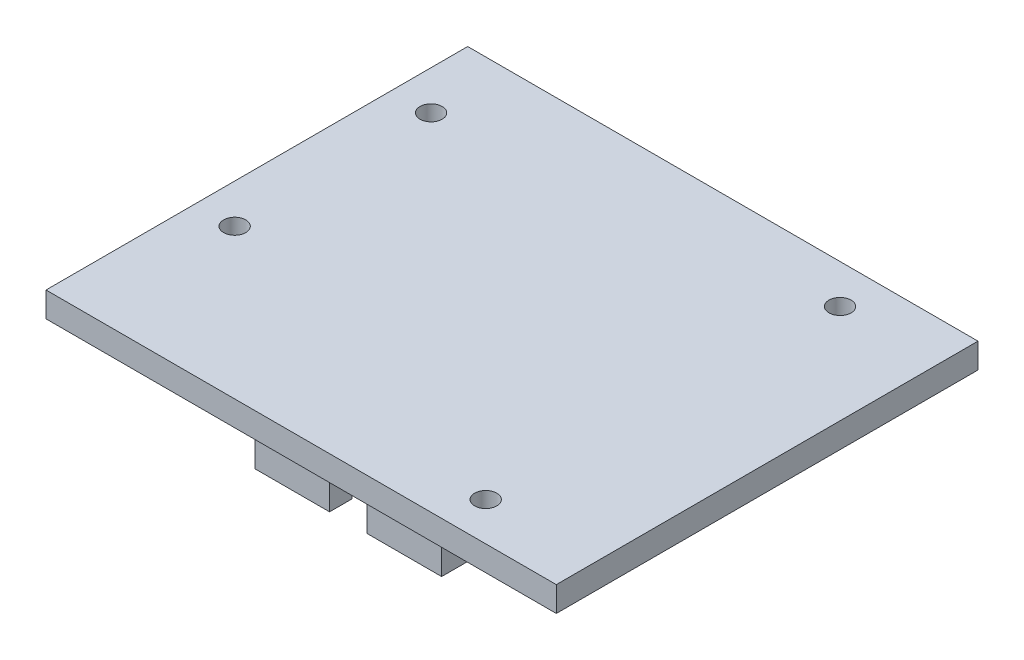
ISO-10303-21;
HEADER;
FILE_DESCRIPTION(('STEP AP214'),'2;1');
FILE_NAME('part.step','',(''),(''),'','','');
FILE_SCHEMA(('AUTOMOTIVE_DESIGN { 1 0 10303 214 1 1 1 1 }'));
ENDSEC;
DATA;
#1=APPLICATION_CONTEXT('core data for automotive mechanical design processes');
#2=APPLICATION_PROTOCOL_DEFINITION('international standard','automotive_design',2000,#1);
#3=PRODUCT_CONTEXT('',#1,'mechanical');
#4=PRODUCT('Part','Part','',(#3));
#5=PRODUCT_RELATED_PRODUCT_CATEGORY('part','',(#4));
#6=PRODUCT_DEFINITION_FORMATION('','',#4);
#7=PRODUCT_DEFINITION_CONTEXT('part definition',#1,'design');
#8=PRODUCT_DEFINITION('design','',#6,#7);
#9=PRODUCT_DEFINITION_SHAPE('','',#8);
#10=(LENGTH_UNIT() NAMED_UNIT(*) SI_UNIT(.MILLI.,.METRE.));
#11=(NAMED_UNIT(*) PLANE_ANGLE_UNIT() SI_UNIT($,.RADIAN.));
#12=(NAMED_UNIT(*) SI_UNIT($,.STERADIAN.) SOLID_ANGLE_UNIT());
#13=UNCERTAINTY_MEASURE_WITH_UNIT(LENGTH_MEASURE(1.E-05),#10,'distance_accuracy_value','');
#14=(GEOMETRIC_REPRESENTATION_CONTEXT(3) GLOBAL_UNCERTAINTY_ASSIGNED_CONTEXT((#13)) GLOBAL_UNIT_ASSIGNED_CONTEXT((#10,
#11,#12)) REPRESENTATION_CONTEXT('',''));
#15=CARTESIAN_POINT('',(0.,0.,0.));
#16=DIRECTION('',(0.,0.,1.));
#17=DIRECTION('',(1.,0.,0.));
#18=AXIS2_PLACEMENT_3D('',#15,#16,#17);
#19=CARTESIAN_POINT('',(2.525,-3.5,12.9));
#20=DIRECTION('',(1.,0.,0.));
#21=DIRECTION('',(0.,1.,0.));
#22=AXIS2_PLACEMENT_3D('',#19,#20,#21);
#23=PLANE('',#22);
#24=DIRECTION('',(0.,0.,-1.));
#25=VECTOR('',#24,1.);
#26=CARTESIAN_POINT('',(2.525,-3.65,22.9));
#27=LINE('',#26,#25);
#28=CARTESIAN_POINT('',(2.525,-3.65,22.9));
#29=VERTEX_POINT('',#28);
#30=CARTESIAN_POINT('',(2.525,-3.65,19.775));
#31=VERTEX_POINT('',#30);
#32=EDGE_CURVE('E171',#29,#31,#27,.T.);
#33=ORIENTED_EDGE('',*,*,#32,.F.);
#34=DIRECTION('',(0.,1.,0.));
#35=VECTOR('',#34,1.);
#36=CARTESIAN_POINT('',(2.525,-3.5,22.9));
#37=LINE('',#36,#35);
#38=CARTESIAN_POINT('',(2.525,-3.5,22.9));
#39=VERTEX_POINT('',#38);
#40=EDGE_CURVE('E378',#29,#39,#37,.T.);
#41=ORIENTED_EDGE('',*,*,#40,.T.);
#42=DIRECTION('',(0.,0.,1.));
#43=VECTOR('',#42,1.);
#44=CARTESIAN_POINT('',(2.525,-3.5,12.9));
#45=LINE('',#44,#43);
#46=CARTESIAN_POINT('',(2.525,-3.5,19.775));
#47=VERTEX_POINT('',#46);
#48=EDGE_CURVE('E191',#47,#39,#45,.T.);
#49=ORIENTED_EDGE('',*,*,#48,.F.);
#50=DIRECTION('',(0.,1.,0.));
#51=VECTOR('',#50,1.);
#52=CARTESIAN_POINT('',(2.525,-3.5,19.775));
#53=LINE('',#52,#51);
#54=EDGE_CURVE('E185',#31,#47,#53,.T.);
#55=ORIENTED_EDGE('',*,*,#54,.F.);
#56=EDGE_LOOP('',(#33,#41,#49,#55));
#57=FACE_BOUND('',#56,.T.);
#58=ADVANCED_FACE('F33',(#57),#23,.F.);
#59=CARTESIAN_POINT('',(13.055,-13.65,22.9));
#60=DIRECTION('',(0.,0.,-1.));
#61=DIRECTION('',(-1.,0.,0.));
#62=AXIS2_PLACEMENT_3D('',#59,#60,#61);
#63=PLANE('',#62);
#64=DIRECTION('',(-1.,0.,0.));
#65=VECTOR('',#64,1.);
#66=CARTESIAN_POINT('',(2.525,-3.65,22.9));
#67=LINE('',#66,#65);
#68=CARTESIAN_POINT('',(2.625,-3.65,22.9));
#69=VERTEX_POINT('',#68);
#70=EDGE_CURVE('E50',#69,#29,#67,.T.);
#71=ORIENTED_EDGE('',*,*,#70,.F.);
#72=DIRECTION('',(0.,-1.,0.));
#73=VECTOR('',#72,1.);
#74=CARTESIAN_POINT('',(2.625,-3.65,22.9));
#75=LINE('',#74,#73);
#76=CARTESIAN_POINT('',(2.625,-13.65,22.9));
#77=VERTEX_POINT('',#76);
#78=EDGE_CURVE('E415',#69,#77,#75,.T.);
#79=ORIENTED_EDGE('',*,*,#78,.T.);
#80=DIRECTION('',(-1.,0.,0.));
#81=VECTOR('',#80,1.);
#82=CARTESIAN_POINT('',(13.055,-13.65,22.9));
#83=LINE('',#82,#81);
#84=CARTESIAN_POINT('',(13.055,-13.65,22.9));
#85=VERTEX_POINT('',#84);
#86=EDGE_CURVE('E243',#85,#77,#83,.T.);
#87=ORIENTED_EDGE('',*,*,#86,.F.);
#88=DIRECTION('',(0.,1.,0.));
#89=VECTOR('',#88,1.);
#90=CARTESIAN_POINT('',(13.055,-13.65,22.9));
#91=LINE('',#90,#89);
#92=CARTESIAN_POINT('',(13.055,-3.5,22.9));
#93=VERTEX_POINT('',#92);
#94=EDGE_CURVE('E260',#85,#93,#91,.T.);
#95=ORIENTED_EDGE('',*,*,#94,.T.);
#96=DIRECTION('',(-1.,0.,0.));
#97=VECTOR('',#96,1.);
#98=CARTESIAN_POINT('',(13.055,-3.5,22.9));
#99=LINE('',#98,#97);
#100=EDGE_CURVE('E238',#93,#39,#99,.T.);
#101=ORIENTED_EDGE('',*,*,#100,.T.);
#102=ORIENTED_EDGE('',*,*,#40,.F.);
#103=EDGE_LOOP('',(#71,#79,#87,#95,#101,#102));
#104=FACE_BOUND('',#103,.T.);
#105=ADVANCED_FACE('F438',(#104),#63,.F.);
#106=CARTESIAN_POINT('',(10.,-3.5,19.775));
#107=DIRECTION('',(0.,0.,1.));
#108=DIRECTION('',(1.,0.,0.));
#109=AXIS2_PLACEMENT_3D('',#106,#107,#108);
#110=PLANE('',#109);
#111=DIRECTION('',(-1.,0.,0.));
#112=VECTOR('',#111,1.);
#113=CARTESIAN_POINT('',(10.,-13.65,19.775));
#114=LINE('',#113,#112);
#115=CARTESIAN_POINT('',(10.,-13.65,19.775));
#116=VERTEX_POINT('',#115);
#117=CARTESIAN_POINT('',(2.625,-13.65,19.775));
#118=VERTEX_POINT('',#117);
#119=EDGE_CURVE('E207',#116,#118,#114,.T.);
#120=ORIENTED_EDGE('',*,*,#119,.T.);
#121=DIRECTION('',(0.,-1.,0.));
#122=VECTOR('',#121,1.);
#123=CARTESIAN_POINT('',(2.625,-3.65,19.775));
#124=LINE('',#123,#122);
#125=CARTESIAN_POINT('',(2.625,-3.65,19.775));
#126=VERTEX_POINT('',#125);
#127=EDGE_CURVE('E187',#126,#118,#124,.T.);
#128=ORIENTED_EDGE('',*,*,#127,.F.);
#129=DIRECTION('',(1.,0.,0.));
#130=VECTOR('',#129,1.);
#131=CARTESIAN_POINT('',(2.525,-3.65,19.775));
#132=LINE('',#131,#130);
#133=EDGE_CURVE('E174',#31,#126,#132,.T.);
#134=ORIENTED_EDGE('',*,*,#133,.F.);
#135=ORIENTED_EDGE('',*,*,#54,.T.);
#136=DIRECTION('',(-1.,0.,0.));
#137=VECTOR('',#136,1.);
#138=CARTESIAN_POINT('',(10.,-3.5,19.775));
#139=LINE('',#138,#137);
#140=CARTESIAN_POINT('',(10.,-3.5,19.775));
#141=VERTEX_POINT('',#140);
#142=EDGE_CURVE('E214',#141,#47,#139,.T.);
#143=ORIENTED_EDGE('',*,*,#142,.F.);
#144=DIRECTION('',(0.,-1.,0.));
#145=VECTOR('',#144,1.);
#146=CARTESIAN_POINT('',(10.,-3.5,19.775));
#147=LINE('',#146,#145);
#148=EDGE_CURVE('E228',#141,#116,#147,.T.);
#149=ORIENTED_EDGE('',*,*,#148,.T.);
#150=EDGE_LOOP('',(#120,#128,#134,#135,#143,#149));
#151=FACE_BOUND('',#150,.T.);
#152=ADVANCED_FACE('F183',(#151),#110,.F.);
#153=CARTESIAN_POINT('',(0.,-3.5,0.));
#154=DIRECTION('',(0.,1.,0.));
#155=DIRECTION('',(0.,0.,1.));
#156=AXIS2_PLACEMENT_3D('',#153,#154,#155);
#157=PLANE('',#156);
#158=DIRECTION('',(0.,0.,1.));
#159=VECTOR('',#158,1.);
#160=CARTESIAN_POINT('',(-35.7,-3.5,29.5));
#161=LINE('',#160,#159);
#162=CARTESIAN_POINT('',(-35.7,-3.5,-29.5));
#163=VERTEX_POINT('',#162);
#164=CARTESIAN_POINT('',(-35.7,-3.5,29.5));
#165=VERTEX_POINT('',#164);
#166=EDGE_CURVE('E285',#163,#165,#161,.T.);
#167=ORIENTED_EDGE('',*,*,#166,.F.);
#168=DIRECTION('',(-1.,0.,0.));
#169=VECTOR('',#168,1.);
#170=CARTESIAN_POINT('',(35.7,-3.5,-29.5));
#171=LINE('',#170,#169);
#172=CARTESIAN_POINT('',(35.7,-3.5,-29.5));
#173=VERTEX_POINT('',#172);
#174=EDGE_CURVE('E295',#173,#163,#171,.T.);
#175=ORIENTED_EDGE('',*,*,#174,.F.);
#176=DIRECTION('',(0.,0.,-1.));
#177=VECTOR('',#176,1.);
#178=CARTESIAN_POINT('',(35.7,-3.5,29.5));
#179=LINE('',#178,#177);
#180=CARTESIAN_POINT('',(35.7,-3.5,29.5));
#181=VERTEX_POINT('',#180);
#182=EDGE_CURVE('E292',#181,#173,#179,.T.);
#183=ORIENTED_EDGE('',*,*,#182,.F.);
#184=DIRECTION('',(1.,0.,0.));
#185=VECTOR('',#184,1.);
#186=CARTESIAN_POINT('',(35.7,-3.5,29.5));
#187=LINE('',#186,#185);
#188=EDGE_CURVE('E288',#165,#181,#187,.T.);
#189=ORIENTED_EDGE('',*,*,#188,.F.);
#190=EDGE_LOOP('',(#167,#175,#183,#189));
#191=FACE_BOUND('',#190,.T.);
#192=CARTESIAN_POINT('',(20.453418066521,-3.5,24.1305439149757));
#193=DIRECTION('',(0.,1.,0.));
#194=DIRECTION('',(0.,0.,1.));
#195=AXIS2_PLACEMENT_3D('',#192,#193,#194);
#196=CIRCLE('',#195,1.55);
#197=CARTESIAN_POINT('',(20.453418066521,-3.5,25.6805439149757));
#198=VERTEX_POINT('',#197);
#199=EDGE_CURVE('E281',#198,#198,#196,.T.);
#200=ORIENTED_EDGE('',*,*,#199,.T.);
#201=EDGE_LOOP('',(#200));
#202=FACE_BOUND('',#201,.T.);
#203=CARTESIAN_POINT('',(-30.2235775893681,-3.5,-18.9));
#204=DIRECTION('',(0.,1.,0.));
#205=DIRECTION('',(0.,0.,1.));
#206=AXIS2_PLACEMENT_3D('',#203,#204,#205);
#207=CIRCLE('',#206,1.55);
#208=CARTESIAN_POINT('',(-30.2235775893681,-3.5,-17.35));
#209=VERTEX_POINT('',#208);
#210=EDGE_CURVE('E270',#209,#209,#207,.T.);
#211=ORIENTED_EDGE('',*,*,#210,.T.);
#212=EDGE_LOOP('',(#211));
#213=FACE_BOUND('',#212,.T.);
#214=CARTESIAN_POINT('',(-30.2235775893681,-3.5,8.57796743821394));
#215=DIRECTION('',(0.,1.,0.));
#216=DIRECTION('',(0.,0.,1.));
#217=AXIS2_PLACEMENT_3D('',#214,#215,#216);
#218=CIRCLE('',#217,1.55);
#219=CARTESIAN_POINT('',(-30.2235775893681,-3.5,10.1279674382139));
#220=VERTEX_POINT('',#219);
#221=EDGE_CURVE('E274',#220,#220,#218,.T.);
#222=ORIENTED_EDGE('',*,*,#221,.T.);
#223=EDGE_LOOP('',(#222));
#224=FACE_BOUND('',#223,.T.);
#225=CARTESIAN_POINT('',(21.85,-3.5,-24.05));
#226=DIRECTION('',(0.,1.,0.));
#227=DIRECTION('',(0.,0.,1.));
#228=AXIS2_PLACEMENT_3D('',#225,#226,#227);
#229=CIRCLE('',#228,1.55);
#230=CARTESIAN_POINT('',(21.85,-3.5,-22.5));
#231=VERTEX_POINT('',#230);
#232=EDGE_CURVE('E277',#231,#231,#229,.T.);
#233=ORIENTED_EDGE('',*,*,#232,.T.);
#234=EDGE_LOOP('',(#233));
#235=FACE_BOUND('',#234,.T.);
#236=DIRECTION('',(0.,0.,-1.));
#237=VECTOR('',#236,1.);
#238=CARTESIAN_POINT('',(-13.055,-3.5,-22.9));
#239=LINE('',#238,#237);
#240=CARTESIAN_POINT('',(-13.055,-3.5,22.9));
#241=VERTEX_POINT('',#240);
#242=CARTESIAN_POINT('',(-13.055,-3.5,-22.9));
#243=VERTEX_POINT('',#242);
#244=EDGE_CURVE('E227',#241,#243,#239,.T.);
#245=ORIENTED_EDGE('',*,*,#244,.F.);
#246=CARTESIAN_POINT('',(-2.525,-3.5,22.9));
#247=VERTEX_POINT('',#246);
#248=EDGE_CURVE('E255',#247,#241,#99,.T.);
#249=ORIENTED_EDGE('',*,*,#248,.F.);
#250=DIRECTION('',(0.,0.,1.));
#251=VECTOR('',#250,1.);
#252=CARTESIAN_POINT('',(-2.525,-3.5,12.9));
#253=LINE('',#252,#251);
#254=CARTESIAN_POINT('',(-2.525,-3.5,19.775));
#255=VERTEX_POINT('',#254);
#256=EDGE_CURVE('E199',#255,#247,#253,.T.);
#257=ORIENTED_EDGE('',*,*,#256,.F.);
#258=CARTESIAN_POINT('',(-10.,-3.5,19.775));
#259=VERTEX_POINT('',#258);
#260=EDGE_CURVE('E213',#255,#259,#139,.T.);
#261=ORIENTED_EDGE('',*,*,#260,.T.);
#262=DIRECTION('',(0.,0.,-1.));
#263=VECTOR('',#262,1.);
#264=CARTESIAN_POINT('',(-10.,-3.5,-19.775));
#265=LINE('',#264,#263);
#266=CARTESIAN_POINT('',(-10.,-3.5,-19.775));
#267=VERTEX_POINT('',#266);
#268=EDGE_CURVE('E203',#259,#267,#265,.T.);
#269=ORIENTED_EDGE('',*,*,#268,.T.);
#270=DIRECTION('',(1.,0.,0.));
#271=VECTOR('',#270,1.);
#272=CARTESIAN_POINT('',(10.,-3.5,-19.775));
#273=LINE('',#272,#271);
#274=CARTESIAN_POINT('',(10.,-3.5,-19.775));
#275=VERTEX_POINT('',#274);
#276=EDGE_CURVE('E206',#267,#275,#273,.T.);
#277=ORIENTED_EDGE('',*,*,#276,.T.);
#278=DIRECTION('',(0.,0.,1.));
#279=VECTOR('',#278,1.);
#280=CARTESIAN_POINT('',(10.,-3.5,-19.775));
#281=LINE('',#280,#279);
#282=EDGE_CURVE('E210',#275,#141,#281,.T.);
#283=ORIENTED_EDGE('',*,*,#282,.T.);
#284=ORIENTED_EDGE('',*,*,#142,.T.);
#285=ORIENTED_EDGE('',*,*,#48,.T.);
#286=ORIENTED_EDGE('',*,*,#100,.F.);
#287=DIRECTION('',(0.,0.,1.));
#288=VECTOR('',#287,1.);
#289=CARTESIAN_POINT('',(13.055,-3.5,-22.9));
#290=LINE('',#289,#288);
#291=CARTESIAN_POINT('',(13.055,-3.5,-22.9));
#292=VERTEX_POINT('',#291);
#293=EDGE_CURVE('E252',#292,#93,#290,.T.);
#294=ORIENTED_EDGE('',*,*,#293,.F.);
#295=DIRECTION('',(1.,0.,0.));
#296=VECTOR('',#295,1.);
#297=CARTESIAN_POINT('',(13.055,-3.5,-22.9));
#298=LINE('',#297,#296);
#299=EDGE_CURVE('E249',#243,#292,#298,.T.);
#300=ORIENTED_EDGE('',*,*,#299,.F.);
#301=EDGE_LOOP('',(#245,#249,#257,#261,#269,#277,#283,#284,#285,#286,#294,#300));
#302=FACE_BOUND('',#301,.T.);
#303=ADVANCED_FACE('F348',(#191,#202,#213,#224,#235,#302),#157,.F.);
#304=CARTESIAN_POINT('',(-35.7,-3.5,29.5));
#305=DIRECTION('',(-1.,0.,0.));
#306=DIRECTION('',(0.,0.,1.));
#307=AXIS2_PLACEMENT_3D('',#304,#305,#306);
#308=PLANE('',#307);
#309=DIRECTION('',(0.,0.,1.));
#310=VECTOR('',#309,1.);
#311=CARTESIAN_POINT('',(-35.7,0.,29.5));
#312=LINE('',#311,#310);
#313=CARTESIAN_POINT('',(-35.7,0.,-29.5));
#314=VERTEX_POINT('',#313);
#315=CARTESIAN_POINT('',(-35.7,0.,29.5));
#316=VERTEX_POINT('',#315);
#317=EDGE_CURVE('E284',#314,#316,#312,.T.);
#318=ORIENTED_EDGE('',*,*,#317,.F.);
#319=DIRECTION('',(0.,1.,0.));
#320=VECTOR('',#319,1.);
#321=CARTESIAN_POINT('',(-35.7,-3.5,-29.5));
#322=LINE('',#321,#320);
#323=EDGE_CURVE('E11',#163,#314,#322,.T.);
#324=ORIENTED_EDGE('',*,*,#323,.F.);
#325=ORIENTED_EDGE('',*,*,#166,.T.);
#326=DIRECTION('',(0.,1.,0.));
#327=VECTOR('',#326,1.);
#328=CARTESIAN_POINT('',(-35.7,-3.5,29.5));
#329=LINE('',#328,#327);
#330=EDGE_CURVE('E298',#165,#316,#329,.T.);
#331=ORIENTED_EDGE('',*,*,#330,.T.);
#332=EDGE_LOOP('',(#318,#324,#325,#331));
#333=FACE_BOUND('',#332,.T.);
#334=ADVANCED_FACE('F35',(#333),#308,.T.);
#335=CARTESIAN_POINT('',(35.7,-3.5,-29.5));
#336=DIRECTION('',(0.,0.,-1.));
#337=DIRECTION('',(-1.,0.,0.));
#338=AXIS2_PLACEMENT_3D('',#335,#336,#337);
#339=PLANE('',#338);
#340=DIRECTION('',(-1.,0.,0.));
#341=VECTOR('',#340,1.);
#342=CARTESIAN_POINT('',(35.7,0.,-29.5));
#343=LINE('',#342,#341);
#344=CARTESIAN_POINT('',(35.7,0.,-29.5));
#345=VERTEX_POINT('',#344);
#346=EDGE_CURVE('E289',#345,#314,#343,.T.);
#347=ORIENTED_EDGE('',*,*,#346,.F.);
#348=DIRECTION('',(0.,1.,0.));
#349=VECTOR('',#348,1.);
#350=CARTESIAN_POINT('',(35.7,-3.5,-29.5));
#351=LINE('',#350,#349);
#352=EDGE_CURVE('E42',#173,#345,#351,.T.);
#353=ORIENTED_EDGE('',*,*,#352,.F.);
#354=ORIENTED_EDGE('',*,*,#174,.T.);
#355=ORIENTED_EDGE('',*,*,#323,.T.);
#356=EDGE_LOOP('',(#347,#353,#354,#355));
#357=FACE_BOUND('',#356,.T.);
#358=ADVANCED_FACE('F345',(#357),#339,.T.);
#359=CARTESIAN_POINT('',(35.7,-3.5,29.5));
#360=DIRECTION('',(1.,0.,0.));
#361=DIRECTION('',(0.,0.,-1.));
#362=AXIS2_PLACEMENT_3D('',#359,#360,#361);
#363=PLANE('',#362);
#364=DIRECTION('',(0.,0.,-1.));
#365=VECTOR('',#364,1.);
#366=CARTESIAN_POINT('',(35.7,0.,29.5));
#367=LINE('',#366,#365);
#368=CARTESIAN_POINT('',(35.7,0.,29.5));
#369=VERTEX_POINT('',#368);
#370=EDGE_CURVE('E304',#369,#345,#367,.T.);
#371=ORIENTED_EDGE('',*,*,#370,.F.);
#372=DIRECTION('',(0.,1.,0.));
#373=VECTOR('',#372,1.);
#374=CARTESIAN_POINT('',(35.7,-3.5,29.5));
#375=LINE('',#374,#373);
#376=EDGE_CURVE('E310',#181,#369,#375,.T.);
#377=ORIENTED_EDGE('',*,*,#376,.F.);
#378=ORIENTED_EDGE('',*,*,#182,.T.);
#379=ORIENTED_EDGE('',*,*,#352,.T.);
#380=EDGE_LOOP('',(#371,#377,#378,#379));
#381=FACE_BOUND('',#380,.T.);
#382=ADVANCED_FACE('F343',(#381),#363,.T.);
#383=CARTESIAN_POINT('',(35.7,-3.5,29.5));
#384=DIRECTION('',(0.,0.,1.));
#385=DIRECTION('',(1.,0.,0.));
#386=AXIS2_PLACEMENT_3D('',#383,#384,#385);
#387=PLANE('',#386);
#388=DIRECTION('',(1.,0.,0.));
#389=VECTOR('',#388,1.);
#390=CARTESIAN_POINT('',(35.7,0.,29.5));
#391=LINE('',#390,#389);
#392=EDGE_CURVE('E301',#316,#369,#391,.T.);
#393=ORIENTED_EDGE('',*,*,#392,.F.);
#394=ORIENTED_EDGE('',*,*,#330,.F.);
#395=ORIENTED_EDGE('',*,*,#188,.T.);
#396=ORIENTED_EDGE('',*,*,#376,.T.);
#397=EDGE_LOOP('',(#393,#394,#395,#396));
#398=FACE_BOUND('',#397,.T.);
#399=ADVANCED_FACE('F326',(#398),#387,.T.);
#400=CARTESIAN_POINT('',(0.,0.,0.));
#401=DIRECTION('',(0.,1.,0.));
#402=DIRECTION('',(0.,0.,1.));
#403=AXIS2_PLACEMENT_3D('',#400,#401,#402);
#404=PLANE('',#403);
#405=CARTESIAN_POINT('',(21.85,0.,-24.05));
#406=DIRECTION('',(0.,1.,0.));
#407=DIRECTION('',(0.,0.,1.));
#408=AXIS2_PLACEMENT_3D('',#405,#406,#407);
#409=CIRCLE('',#408,1.55);
#410=CARTESIAN_POINT('',(21.85,0.,-22.5));
#411=VERTEX_POINT('',#410);
#412=EDGE_CURVE('E37',#411,#411,#409,.T.);
#413=ORIENTED_EDGE('',*,*,#412,.F.);
#414=EDGE_LOOP('',(#413));
#415=FACE_BOUND('',#414,.T.);
#416=CARTESIAN_POINT('',(-30.2235775893681,0.,8.57796743821394));
#417=DIRECTION('',(0.,1.,0.));
#418=DIRECTION('',(0.,0.,1.));
#419=AXIS2_PLACEMENT_3D('',#416,#417,#418);
#420=CIRCLE('',#419,1.55);
#421=CARTESIAN_POINT('',(-30.2235775893681,0.,10.1279674382139));
#422=VERTEX_POINT('',#421);
#423=EDGE_CURVE('E273',#422,#422,#420,.T.);
#424=ORIENTED_EDGE('',*,*,#423,.F.);
#425=EDGE_LOOP('',(#424));
#426=FACE_BOUND('',#425,.T.);
#427=CARTESIAN_POINT('',(-30.2235775893681,0.,-18.9));
#428=DIRECTION('',(0.,1.,0.));
#429=DIRECTION('',(0.,0.,1.));
#430=AXIS2_PLACEMENT_3D('',#427,#428,#429);
#431=CIRCLE('',#430,1.55);
#432=CARTESIAN_POINT('',(-30.2235775893681,0.,-17.35));
#433=VERTEX_POINT('',#432);
#434=EDGE_CURVE('E269',#433,#433,#431,.T.);
#435=ORIENTED_EDGE('',*,*,#434,.F.);
#436=EDGE_LOOP('',(#435));
#437=FACE_BOUND('',#436,.T.);
#438=CARTESIAN_POINT('',(20.453418066521,0.,24.1305439149757));
#439=DIRECTION('',(0.,1.,0.));
#440=DIRECTION('',(0.,0.,1.));
#441=AXIS2_PLACEMENT_3D('',#438,#439,#440);
#442=CIRCLE('',#441,1.55);
#443=CARTESIAN_POINT('',(20.453418066521,0.,25.6805439149757));
#444=VERTEX_POINT('',#443);
#445=EDGE_CURVE('E280',#444,#444,#442,.T.);
#446=ORIENTED_EDGE('',*,*,#445,.F.);
#447=EDGE_LOOP('',(#446));
#448=FACE_BOUND('',#447,.T.);
#449=ORIENTED_EDGE('',*,*,#317,.T.);
#450=ORIENTED_EDGE('',*,*,#392,.T.);
#451=ORIENTED_EDGE('',*,*,#370,.T.);
#452=ORIENTED_EDGE('',*,*,#346,.T.);
#453=EDGE_LOOP('',(#449,#450,#451,#452));
#454=FACE_BOUND('',#453,.T.);
#455=ADVANCED_FACE('F322',(#415,#426,#437,#448,#454),#404,.T.);
#456=CARTESIAN_POINT('',(20.453418066521,-15.,24.1305439149757));
#457=DIRECTION('',(0.,1.,0.));
#458=DIRECTION('',(0.,0.,1.));
#459=AXIS2_PLACEMENT_3D('',#456,#457,#458);
#460=CYLINDRICAL_SURFACE('',#459,1.55);
#461=ORIENTED_EDGE('',*,*,#445,.T.);
#462=EDGE_LOOP('',(#461));
#463=FACE_BOUND('',#462,.T.);
#464=ORIENTED_EDGE('',*,*,#199,.F.);
#465=EDGE_LOOP('',(#464));
#466=FACE_BOUND('',#465,.T.);
#467=ADVANCED_FACE('F325',(#463,#466),#460,.F.);
#468=CARTESIAN_POINT('',(-30.2235775893681,-15.,-18.9));
#469=DIRECTION('',(0.,1.,0.));
#470=DIRECTION('',(0.,0.,1.));
#471=AXIS2_PLACEMENT_3D('',#468,#469,#470);
#472=CYLINDRICAL_SURFACE('',#471,1.55);
#473=ORIENTED_EDGE('',*,*,#434,.T.);
#474=EDGE_LOOP('',(#473));
#475=FACE_BOUND('',#474,.T.);
#476=ORIENTED_EDGE('',*,*,#210,.F.);
#477=EDGE_LOOP('',(#476));
#478=FACE_BOUND('',#477,.T.);
#479=ADVANCED_FACE('F478',(#475,#478),#472,.F.);
#480=CARTESIAN_POINT('',(-30.2235775893681,-15.,8.57796743821394));
#481=DIRECTION('',(0.,1.,0.));
#482=DIRECTION('',(0.,0.,1.));
#483=AXIS2_PLACEMENT_3D('',#480,#481,#482);
#484=CYLINDRICAL_SURFACE('',#483,1.55);
#485=ORIENTED_EDGE('',*,*,#423,.T.);
#486=EDGE_LOOP('',(#485));
#487=FACE_BOUND('',#486,.T.);
#488=ORIENTED_EDGE('',*,*,#221,.F.);
#489=EDGE_LOOP('',(#488));
#490=FACE_BOUND('',#489,.T.);
#491=ADVANCED_FACE('F319',(#487,#490),#484,.F.);
#492=CARTESIAN_POINT('',(21.85,-15.,-24.05));
#493=DIRECTION('',(0.,1.,0.));
#494=DIRECTION('',(0.,0.,1.));
#495=AXIS2_PLACEMENT_3D('',#492,#493,#494);
#496=CYLINDRICAL_SURFACE('',#495,1.55);
#497=ORIENTED_EDGE('',*,*,#412,.T.);
#498=EDGE_LOOP('',(#497));
#499=FACE_BOUND('',#498,.T.);
#500=ORIENTED_EDGE('',*,*,#232,.F.);
#501=EDGE_LOOP('',(#500));
#502=FACE_BOUND('',#501,.T.);
#503=ADVANCED_FACE('F475',(#499,#502),#496,.F.);
#504=CARTESIAN_POINT('',(-13.055,-13.65,-22.9));
#505=DIRECTION('',(1.,0.,0.));
#506=DIRECTION('',(0.,0.,-1.));
#507=AXIS2_PLACEMENT_3D('',#504,#505,#506);
#508=PLANE('',#507);
#509=ORIENTED_EDGE('',*,*,#244,.T.);
#510=DIRECTION('',(0.,1.,0.));
#511=VECTOR('',#510,1.);
#512=CARTESIAN_POINT('',(-13.055,-13.65,-22.9));
#513=LINE('',#512,#511);
#514=CARTESIAN_POINT('',(-13.055,-13.65,-22.9));
#515=VERTEX_POINT('',#514);
#516=EDGE_CURVE('E266',#515,#243,#513,.T.);
#517=ORIENTED_EDGE('',*,*,#516,.F.);
#518=DIRECTION('',(0.,0.,-1.));
#519=VECTOR('',#518,1.);
#520=CARTESIAN_POINT('',(-13.055,-13.65,-22.9));
#521=LINE('',#520,#519);
#522=CARTESIAN_POINT('',(-13.055,-13.65,22.9));
#523=VERTEX_POINT('',#522);
#524=EDGE_CURVE('E234',#523,#515,#521,.T.);
#525=ORIENTED_EDGE('',*,*,#524,.F.);
#526=DIRECTION('',(0.,1.,0.));
#527=VECTOR('',#526,1.);
#528=CARTESIAN_POINT('',(-13.055,-13.65,22.9));
#529=LINE('',#528,#527);
#530=EDGE_CURVE('E246',#523,#241,#529,.T.);
#531=ORIENTED_EDGE('',*,*,#530,.T.);
#532=EDGE_LOOP('',(#509,#517,#525,#531));
#533=FACE_BOUND('',#532,.T.);
#534=ADVANCED_FACE('F366',(#533),#508,.F.);
#535=CARTESIAN_POINT('',(13.055,-13.65,-22.9));
#536=DIRECTION('',(0.,0.,1.));
#537=DIRECTION('',(1.,0.,0.));
#538=AXIS2_PLACEMENT_3D('',#535,#536,#537);
#539=PLANE('',#538);
#540=ORIENTED_EDGE('',*,*,#299,.T.);
#541=DIRECTION('',(0.,1.,0.));
#542=VECTOR('',#541,1.);
#543=CARTESIAN_POINT('',(13.055,-13.65,-22.9));
#544=LINE('',#543,#542);
#545=CARTESIAN_POINT('',(13.055,-13.65,-22.9));
#546=VERTEX_POINT('',#545);
#547=EDGE_CURVE('E263',#546,#292,#544,.T.);
#548=ORIENTED_EDGE('',*,*,#547,.F.);
#549=DIRECTION('',(1.,0.,0.));
#550=VECTOR('',#549,1.);
#551=CARTESIAN_POINT('',(13.055,-13.65,-22.9));
#552=LINE('',#551,#550);
#553=EDGE_CURVE('E237',#515,#546,#552,.T.);
#554=ORIENTED_EDGE('',*,*,#553,.F.);
#555=ORIENTED_EDGE('',*,*,#516,.T.);
#556=EDGE_LOOP('',(#540,#548,#554,#555));
#557=FACE_BOUND('',#556,.T.);
#558=ADVANCED_FACE('F432',(#557),#539,.F.);
#559=CARTESIAN_POINT('',(13.055,-13.65,-22.9));
#560=DIRECTION('',(-1.,0.,0.));
#561=DIRECTION('',(0.,0.,1.));
#562=AXIS2_PLACEMENT_3D('',#559,#560,#561);
#563=PLANE('',#562);
#564=ORIENTED_EDGE('',*,*,#293,.T.);
#565=ORIENTED_EDGE('',*,*,#94,.F.);
#566=DIRECTION('',(0.,0.,1.));
#567=VECTOR('',#566,1.);
#568=CARTESIAN_POINT('',(13.055,-13.65,-22.9));
#569=LINE('',#568,#567);
#570=EDGE_CURVE('E240',#546,#85,#569,.T.);
#571=ORIENTED_EDGE('',*,*,#570,.F.);
#572=ORIENTED_EDGE('',*,*,#547,.T.);
#573=EDGE_LOOP('',(#564,#565,#571,#572));
#574=FACE_BOUND('',#573,.T.);
#575=ADVANCED_FACE('F436',(#574),#563,.F.);
#576=CARTESIAN_POINT('',(-2.625,-13.65,22.9));
#577=VERTEX_POINT('',#576);
#578=EDGE_CURVE('E242',#577,#523,#83,.T.);
#579=ORIENTED_EDGE('',*,*,#578,.F.);
#580=DIRECTION('',(0.,-1.,0.));
#581=VECTOR('',#580,1.);
#582=CARTESIAN_POINT('',(-2.625,-3.65,22.9));
#583=LINE('',#582,#581);
#584=CARTESIAN_POINT('',(-2.625,-3.65,22.9));
#585=VERTEX_POINT('',#584);
#586=EDGE_CURVE('E425',#585,#577,#583,.T.);
#587=ORIENTED_EDGE('',*,*,#586,.F.);
#588=DIRECTION('',(-1.,0.,0.));
#589=VECTOR('',#588,1.);
#590=CARTESIAN_POINT('',(-2.525,-3.65,22.9));
#591=LINE('',#590,#589);
#592=CARTESIAN_POINT('',(-2.525,-3.65,22.9));
#593=VERTEX_POINT('',#592);
#594=EDGE_CURVE('E376',#593,#585,#591,.T.);
#595=ORIENTED_EDGE('',*,*,#594,.F.);
#596=DIRECTION('',(0.,-1.,0.));
#597=VECTOR('',#596,1.);
#598=CARTESIAN_POINT('',(-2.525,-3.5,22.9));
#599=LINE('',#598,#597);
#600=EDGE_CURVE('E374',#247,#593,#599,.T.);
#601=ORIENTED_EDGE('',*,*,#600,.F.);
#602=ORIENTED_EDGE('',*,*,#248,.T.);
#603=ORIENTED_EDGE('',*,*,#530,.F.);
#604=EDGE_LOOP('',(#579,#587,#595,#601,#602,#603));
#605=FACE_BOUND('',#604,.T.);
#606=ADVANCED_FACE('F369',(#605),#63,.F.);
#607=CARTESIAN_POINT('',(0.,-13.65,0.));
#608=DIRECTION('',(0.,-1.,0.));
#609=DIRECTION('',(0.,0.,-1.));
#610=AXIS2_PLACEMENT_3D('',#607,#608,#609);
#611=PLANE('',#610);
#612=DIRECTION('',(0.,0.,1.));
#613=VECTOR('',#612,1.);
#614=CARTESIAN_POINT('',(2.625,-13.65,22.9));
#615=LINE('',#614,#613);
#616=EDGE_CURVE('E179',#118,#77,#615,.T.);
#617=ORIENTED_EDGE('',*,*,#616,.F.);
#618=ORIENTED_EDGE('',*,*,#119,.F.);
#619=DIRECTION('',(0.,0.,1.));
#620=VECTOR('',#619,1.);
#621=CARTESIAN_POINT('',(10.,-13.65,-19.775));
#622=LINE('',#621,#620);
#623=CARTESIAN_POINT('',(10.,-13.65,-19.775));
#624=VERTEX_POINT('',#623);
#625=EDGE_CURVE('E219',#624,#116,#622,.T.);
#626=ORIENTED_EDGE('',*,*,#625,.F.);
#627=DIRECTION('',(1.,0.,0.));
#628=VECTOR('',#627,1.);
#629=CARTESIAN_POINT('',(10.,-13.65,-19.775));
#630=LINE('',#629,#628);
#631=CARTESIAN_POINT('',(-10.,-13.65,-19.775));
#632=VERTEX_POINT('',#631);
#633=EDGE_CURVE('E196',#632,#624,#630,.T.);
#634=ORIENTED_EDGE('',*,*,#633,.F.);
#635=DIRECTION('',(0.,0.,-1.));
#636=VECTOR('',#635,1.);
#637=CARTESIAN_POINT('',(-10.,-13.65,-19.775));
#638=LINE('',#637,#636);
#639=CARTESIAN_POINT('',(-10.,-13.65,19.775));
#640=VERTEX_POINT('',#639);
#641=EDGE_CURVE('E193',#640,#632,#638,.T.);
#642=ORIENTED_EDGE('',*,*,#641,.F.);
#643=CARTESIAN_POINT('',(-2.625,-13.65,19.775));
#644=VERTEX_POINT('',#643);
#645=EDGE_CURVE('E222',#644,#640,#114,.T.);
#646=ORIENTED_EDGE('',*,*,#645,.F.);
#647=DIRECTION('',(0.,0.,-1.));
#648=VECTOR('',#647,1.);
#649=CARTESIAN_POINT('',(-2.625,-13.65,22.9));
#650=LINE('',#649,#648);
#651=EDGE_CURVE('E417',#577,#644,#650,.T.);
#652=ORIENTED_EDGE('',*,*,#651,.F.);
#653=ORIENTED_EDGE('',*,*,#578,.T.);
#654=ORIENTED_EDGE('',*,*,#524,.T.);
#655=ORIENTED_EDGE('',*,*,#553,.T.);
#656=ORIENTED_EDGE('',*,*,#570,.T.);
#657=ORIENTED_EDGE('',*,*,#86,.T.);
#658=EDGE_LOOP('',(#617,#618,#626,#634,#642,#646,#652,#653,#654,#655,#656,#657));
#659=FACE_BOUND('',#658,.T.);
#660=ADVANCED_FACE('F407',(#659),#611,.T.);
#661=CARTESIAN_POINT('',(-10.,-3.5,-19.775));
#662=DIRECTION('',(-1.,0.,0.));
#663=DIRECTION('',(0.,0.,1.));
#664=AXIS2_PLACEMENT_3D('',#661,#662,#663);
#665=PLANE('',#664);
#666=ORIENTED_EDGE('',*,*,#641,.T.);
#667=DIRECTION('',(0.,-1.,0.));
#668=VECTOR('',#667,1.);
#669=CARTESIAN_POINT('',(-10.,-3.5,-19.775));
#670=LINE('',#669,#668);
#671=EDGE_CURVE('E215',#267,#632,#670,.T.);
#672=ORIENTED_EDGE('',*,*,#671,.F.);
#673=ORIENTED_EDGE('',*,*,#268,.F.);
#674=DIRECTION('',(0.,-1.,0.));
#675=VECTOR('',#674,1.);
#676=CARTESIAN_POINT('',(-10.,-3.5,19.775));
#677=LINE('',#676,#675);
#678=EDGE_CURVE('E224',#259,#640,#677,.T.);
#679=ORIENTED_EDGE('',*,*,#678,.T.);
#680=EDGE_LOOP('',(#666,#672,#673,#679));
#681=FACE_BOUND('',#680,.T.);
#682=ADVANCED_FACE('F395',(#681),#665,.F.);
#683=DIRECTION('',(1.,0.,0.));
#684=VECTOR('',#683,1.);
#685=CARTESIAN_POINT('',(-2.525,-3.65,19.775));
#686=LINE('',#685,#684);
#687=CARTESIAN_POINT('',(-2.625,-3.65,19.775));
#688=VERTEX_POINT('',#687);
#689=CARTESIAN_POINT('',(-2.525,-3.65,19.775));
#690=VERTEX_POINT('',#689);
#691=EDGE_CURVE('E58',#688,#690,#686,.T.);
#692=ORIENTED_EDGE('',*,*,#691,.F.);
#693=DIRECTION('',(0.,-1.,0.));
#694=VECTOR('',#693,1.);
#695=CARTESIAN_POINT('',(-2.625,-3.65,19.775));
#696=LINE('',#695,#694);
#697=EDGE_CURVE('E380',#688,#644,#696,.T.);
#698=ORIENTED_EDGE('',*,*,#697,.T.);
#699=ORIENTED_EDGE('',*,*,#645,.T.);
#700=ORIENTED_EDGE('',*,*,#678,.F.);
#701=ORIENTED_EDGE('',*,*,#260,.F.);
#702=DIRECTION('',(0.,-1.,0.));
#703=VECTOR('',#702,1.);
#704=CARTESIAN_POINT('',(-2.525,-3.5,19.775));
#705=LINE('',#704,#703);
#706=EDGE_CURVE('E194',#255,#690,#705,.T.);
#707=ORIENTED_EDGE('',*,*,#706,.T.);
#708=EDGE_LOOP('',(#692,#698,#699,#700,#701,#707));
#709=FACE_BOUND('',#708,.T.);
#710=ADVANCED_FACE('F390',(#709),#110,.F.);
#711=CARTESIAN_POINT('',(10.,-3.5,-19.775));
#712=DIRECTION('',(1.,0.,0.));
#713=DIRECTION('',(0.,0.,-1.));
#714=AXIS2_PLACEMENT_3D('',#711,#712,#713);
#715=PLANE('',#714);
#716=ORIENTED_EDGE('',*,*,#625,.T.);
#717=ORIENTED_EDGE('',*,*,#148,.F.);
#718=ORIENTED_EDGE('',*,*,#282,.F.);
#719=DIRECTION('',(0.,-1.,0.));
#720=VECTOR('',#719,1.);
#721=CARTESIAN_POINT('',(10.,-3.5,-19.775));
#722=LINE('',#721,#720);
#723=EDGE_CURVE('E230',#275,#624,#722,.T.);
#724=ORIENTED_EDGE('',*,*,#723,.T.);
#725=EDGE_LOOP('',(#716,#717,#718,#724));
#726=FACE_BOUND('',#725,.T.);
#727=ADVANCED_FACE('F404',(#726),#715,.F.);
#728=CARTESIAN_POINT('',(10.,-3.5,-19.775));
#729=DIRECTION('',(0.,0.,-1.));
#730=DIRECTION('',(-1.,0.,0.));
#731=AXIS2_PLACEMENT_3D('',#728,#729,#730);
#732=PLANE('',#731);
#733=ORIENTED_EDGE('',*,*,#633,.T.);
#734=ORIENTED_EDGE('',*,*,#723,.F.);
#735=ORIENTED_EDGE('',*,*,#276,.F.);
#736=ORIENTED_EDGE('',*,*,#671,.T.);
#737=EDGE_LOOP('',(#733,#734,#735,#736));
#738=FACE_BOUND('',#737,.T.);
#739=ADVANCED_FACE('F399',(#738),#732,.F.);
#740=CARTESIAN_POINT('',(-2.525,-3.5,12.9));
#741=DIRECTION('',(-1.,0.,0.));
#742=DIRECTION('',(0.,0.,1.));
#743=AXIS2_PLACEMENT_3D('',#740,#741,#742);
#744=PLANE('',#743);
#745=ORIENTED_EDGE('',*,*,#600,.T.);
#746=DIRECTION('',(0.,0.,1.));
#747=VECTOR('',#746,1.);
#748=CARTESIAN_POINT('',(-2.525,-3.65,22.9));
#749=LINE('',#748,#747);
#750=EDGE_CURVE('E419',#690,#593,#749,.T.);
#751=ORIENTED_EDGE('',*,*,#750,.F.);
#752=ORIENTED_EDGE('',*,*,#706,.F.);
#753=ORIENTED_EDGE('',*,*,#256,.T.);
#754=EDGE_LOOP('',(#745,#751,#752,#753));
#755=FACE_BOUND('',#754,.T.);
#756=ADVANCED_FACE('F385',(#755),#744,.F.);
#757=CARTESIAN_POINT('',(-2.625,-3.65,22.9));
#758=DIRECTION('',(-1.,0.,0.));
#759=DIRECTION('',(0.,0.,1.));
#760=AXIS2_PLACEMENT_3D('',#757,#758,#759);
#761=PLANE('',#760);
#762=ORIENTED_EDGE('',*,*,#651,.T.);
#763=ORIENTED_EDGE('',*,*,#697,.F.);
#764=DIRECTION('',(0.,0.,-1.));
#765=VECTOR('',#764,1.);
#766=CARTESIAN_POINT('',(-2.625,-3.65,22.9));
#767=LINE('',#766,#765);
#768=EDGE_CURVE('E422',#585,#688,#767,.T.);
#769=ORIENTED_EDGE('',*,*,#768,.F.);
#770=ORIENTED_EDGE('',*,*,#586,.T.);
#771=EDGE_LOOP('',(#762,#763,#769,#770));
#772=FACE_BOUND('',#771,.T.);
#773=ADVANCED_FACE('F429',(#772),#761,.F.);
#774=CARTESIAN_POINT('',(0.,-3.65,0.));
#775=DIRECTION('',(0.,1.,0.));
#776=DIRECTION('',(0.,0.,1.));
#777=AXIS2_PLACEMENT_3D('',#774,#775,#776);
#778=PLANE('',#777);
#779=ORIENTED_EDGE('',*,*,#750,.T.);
#780=ORIENTED_EDGE('',*,*,#594,.T.);
#781=ORIENTED_EDGE('',*,*,#768,.T.);
#782=ORIENTED_EDGE('',*,*,#691,.T.);
#783=EDGE_LOOP('',(#779,#780,#781,#782));
#784=FACE_BOUND('',#783,.T.);
#785=ADVANCED_FACE('F441',(#784),#778,.F.);
#786=CARTESIAN_POINT('',(2.625,-3.65,22.9));
#787=DIRECTION('',(1.,0.,0.));
#788=DIRECTION('',(0.,0.,-1.));
#789=AXIS2_PLACEMENT_3D('',#786,#787,#788);
#790=PLANE('',#789);
#791=ORIENTED_EDGE('',*,*,#616,.T.);
#792=ORIENTED_EDGE('',*,*,#78,.F.);
#793=DIRECTION('',(0.,0.,1.));
#794=VECTOR('',#793,1.);
#795=CARTESIAN_POINT('',(2.625,-3.65,22.9));
#796=LINE('',#795,#794);
#797=EDGE_CURVE('E188',#126,#69,#796,.T.);
#798=ORIENTED_EDGE('',*,*,#797,.F.);
#799=ORIENTED_EDGE('',*,*,#127,.T.);
#800=EDGE_LOOP('',(#791,#792,#798,#799));
#801=FACE_BOUND('',#800,.T.);
#802=ADVANCED_FACE('F439',(#801),#790,.F.);
#803=CARTESIAN_POINT('',(0.,-3.65,0.));
#804=DIRECTION('',(0.,-1.,0.));
#805=DIRECTION('',(0.,0.,-1.));
#806=AXIS2_PLACEMENT_3D('',#803,#804,#805);
#807=PLANE('',#806);
#808=ORIENTED_EDGE('',*,*,#32,.T.);
#809=ORIENTED_EDGE('',*,*,#133,.T.);
#810=ORIENTED_EDGE('',*,*,#797,.T.);
#811=ORIENTED_EDGE('',*,*,#70,.T.);
#812=EDGE_LOOP('',(#808,#809,#810,#811));
#813=FACE_BOUND('',#812,.T.);
#814=ADVANCED_FACE('F173',(#813),#807,.T.);
#815=CLOSED_SHELL('',(#58,#105,#152,#303,#334,#358,#382,#399,#455,#467,#479,#491,#503,#534,#558,
#575,#606,#660,#682,#710,#727,#739,#756,#773,#785,#802,#814));
#816=MANIFOLD_SOLID_BREP('B2',#815);
#817=ADVANCED_BREP_SHAPE_REPRESENTATION('',(#18,#816),#14);
#818=SHAPE_DEFINITION_REPRESENTATION(#9,#817);
ENDSEC;
END-ISO-10303-21;
